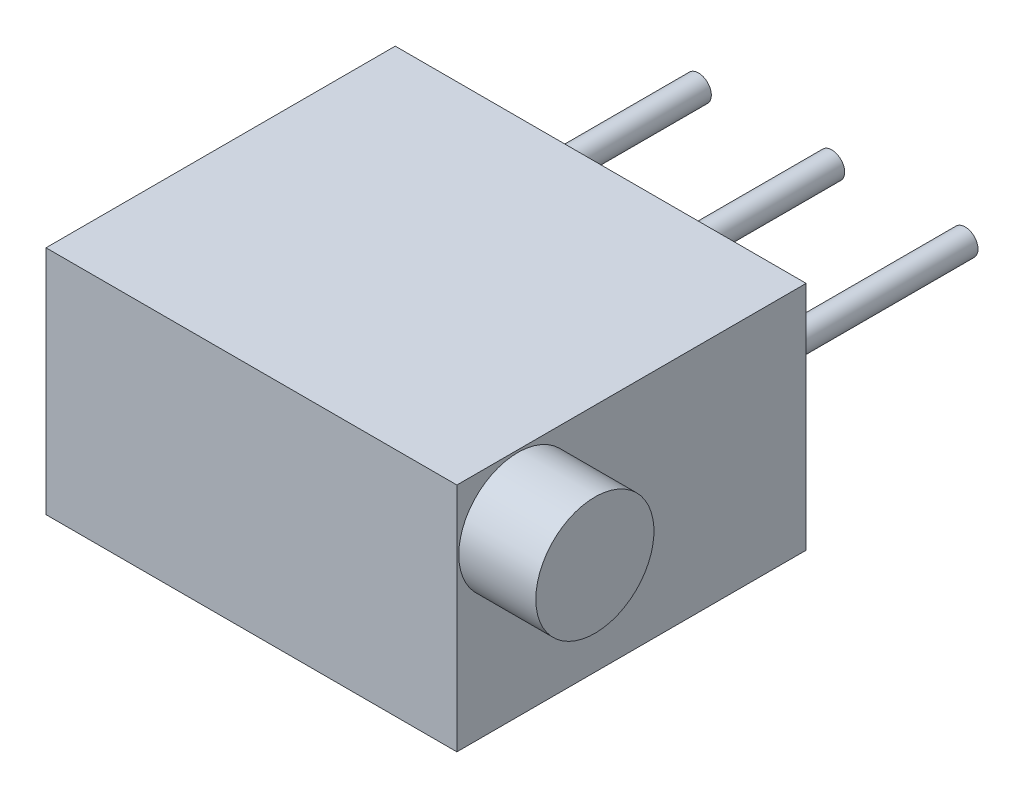
ISO-10303-21;
HEADER;
FILE_DESCRIPTION(('STEP AP214'),'2;1');
FILE_NAME('part.step','',(''),(''),'','','');
FILE_SCHEMA(('AUTOMOTIVE_DESIGN { 1 0 10303 214 1 1 1 1 }'));
ENDSEC;
DATA;
#1=APPLICATION_CONTEXT('core data for automotive mechanical design processes');
#2=APPLICATION_PROTOCOL_DEFINITION('international standard','automotive_design',2000,#1);
#3=PRODUCT_CONTEXT('',#1,'mechanical');
#4=PRODUCT('Part','Part','',(#3));
#5=PRODUCT_RELATED_PRODUCT_CATEGORY('part','',(#4));
#6=PRODUCT_DEFINITION_FORMATION('','',#4);
#7=PRODUCT_DEFINITION_CONTEXT('part definition',#1,'design');
#8=PRODUCT_DEFINITION('design','',#6,#7);
#9=PRODUCT_DEFINITION_SHAPE('','',#8);
#10=(LENGTH_UNIT() NAMED_UNIT(*) SI_UNIT(.MILLI.,.METRE.));
#11=(NAMED_UNIT(*) PLANE_ANGLE_UNIT() SI_UNIT($,.RADIAN.));
#12=(NAMED_UNIT(*) SI_UNIT($,.STERADIAN.) SOLID_ANGLE_UNIT());
#13=UNCERTAINTY_MEASURE_WITH_UNIT(LENGTH_MEASURE(1.E-05),#10,'distance_accuracy_value','');
#14=(GEOMETRIC_REPRESENTATION_CONTEXT(3) GLOBAL_UNCERTAINTY_ASSIGNED_CONTEXT((#13)) GLOBAL_UNIT_ASSIGNED_CONTEXT((#10,
#11,#12)) REPRESENTATION_CONTEXT('',''));
#15=CARTESIAN_POINT('',(0.,0.,0.));
#16=DIRECTION('',(0.,0.,1.));
#17=DIRECTION('',(1.,0.,0.));
#18=AXIS2_PLACEMENT_3D('',#15,#16,#17);
#19=CARTESIAN_POINT('',(-4.,4.5,-3.4));
#20=DIRECTION('',(0.,0.,1.));
#21=DIRECTION('',(1.,0.,0.));
#22=AXIS2_PLACEMENT_3D('',#19,#20,#21);
#23=PLANE('',#22);
#24=CARTESIAN_POINT('',(-2.59597838181529,2.25,-3.40000000000001));
#25=DIRECTION('',(0.,0.,1.));
#26=DIRECTION('',(1.,0.,0.));
#27=AXIS2_PLACEMENT_3D('',#24,#25,#26);
#28=CIRCLE('',#27,0.25);
#29=CARTESIAN_POINT('',(-2.34597838181529,2.25,-3.40000000000001));
#30=VERTEX_POINT('',#29);
#31=EDGE_CURVE('E42',#30,#30,#28,.F.);
#32=ORIENTED_EDGE('',*,*,#31,.F.);
#33=EDGE_LOOP('',(#32));
#34=FACE_BOUND('',#33,.T.);
#35=DIRECTION('',(-1.,0.,0.));
#36=VECTOR('',#35,1.);
#37=CARTESIAN_POINT('',(-4.,0.,-3.4));
#38=LINE('',#37,#36);
#39=CARTESIAN_POINT('',(4.,0.,-3.40000000000001));
#40=VERTEX_POINT('',#39);
#41=CARTESIAN_POINT('',(-4.,0.,-3.4));
#42=VERTEX_POINT('',#41);
#43=EDGE_CURVE('E73',#40,#42,#38,.T.);
#44=ORIENTED_EDGE('',*,*,#43,.T.);
#45=DIRECTION('',(0.,-1.,0.));
#46=VECTOR('',#45,1.);
#47=CARTESIAN_POINT('',(-4.,4.5,-3.4));
#48=LINE('',#47,#46);
#49=CARTESIAN_POINT('',(-4.,4.5,-3.4));
#50=VERTEX_POINT('',#49);
#51=EDGE_CURVE('E97',#50,#42,#48,.T.);
#52=ORIENTED_EDGE('',*,*,#51,.F.);
#53=DIRECTION('',(-1.,0.,0.));
#54=VECTOR('',#53,1.);
#55=CARTESIAN_POINT('',(-4.,4.5,-3.4));
#56=LINE('',#55,#54);
#57=CARTESIAN_POINT('',(4.,4.5,-3.40000000000001));
#58=VERTEX_POINT('',#57);
#59=EDGE_CURVE('E50',#58,#50,#56,.T.);
#60=ORIENTED_EDGE('',*,*,#59,.F.);
#61=DIRECTION('',(0.,-1.,0.));
#62=VECTOR('',#61,1.);
#63=CARTESIAN_POINT('',(4.,4.5,-3.40000000000001));
#64=LINE('',#63,#62);
#65=EDGE_CURVE('E93',#58,#40,#64,.T.);
#66=ORIENTED_EDGE('',*,*,#65,.T.);
#67=EDGE_LOOP('',(#44,#52,#60,#66));
#68=FACE_BOUND('',#67,.T.);
#69=CARTESIAN_POINT('',(0.,2.25,-3.40000000000001));
#70=DIRECTION('',(0.,0.,1.));
#71=DIRECTION('',(1.,0.,0.));
#72=AXIS2_PLACEMENT_3D('',#69,#70,#71);
#73=CIRCLE('',#72,0.25);
#74=CARTESIAN_POINT('',(0.250000000000008,2.25,-3.40000000000001));
#75=VERTEX_POINT('',#74);
#76=EDGE_CURVE('E111',#75,#75,#73,.F.);
#77=ORIENTED_EDGE('',*,*,#76,.F.);
#78=EDGE_LOOP('',(#77));
#79=FACE_BOUND('',#78,.T.);
#80=CARTESIAN_POINT('',(2.5959783818153,2.25,-3.40000000000001));
#81=DIRECTION('',(0.,0.,1.));
#82=DIRECTION('',(1.,0.,0.));
#83=AXIS2_PLACEMENT_3D('',#80,#81,#82);
#84=CIRCLE('',#83,0.25);
#85=CARTESIAN_POINT('',(2.8459783818153,2.25,-3.40000000000001));
#86=VERTEX_POINT('',#85);
#87=EDGE_CURVE('E11',#86,#86,#84,.F.);
#88=ORIENTED_EDGE('',*,*,#87,.F.);
#89=EDGE_LOOP('',(#88));
#90=FACE_BOUND('',#89,.T.);
#91=ADVANCED_FACE('F33',(#34,#68,#79,#90),#23,.F.);
#92=CARTESIAN_POINT('',(-4.,4.5,-3.4));
#93=DIRECTION('',(1.,0.,0.));
#94=DIRECTION('',(0.,0.,-1.));
#95=AXIS2_PLACEMENT_3D('',#92,#93,#94);
#96=PLANE('',#95);
#97=DIRECTION('',(0.,0.,1.));
#98=VECTOR('',#97,1.);
#99=CARTESIAN_POINT('',(-4.,0.,-3.4));
#100=LINE('',#99,#98);
#101=CARTESIAN_POINT('',(-4.,0.,3.39999999999999));
#102=VERTEX_POINT('',#101);
#103=EDGE_CURVE('E101',#42,#102,#100,.T.);
#104=ORIENTED_EDGE('',*,*,#103,.T.);
#105=DIRECTION('',(0.,-1.,0.));
#106=VECTOR('',#105,1.);
#107=CARTESIAN_POINT('',(-4.,4.5,3.39999999999999));
#108=LINE('',#107,#106);
#109=CARTESIAN_POINT('',(-4.,4.5,3.39999999999999));
#110=VERTEX_POINT('',#109);
#111=EDGE_CURVE('E92',#110,#102,#108,.T.);
#112=ORIENTED_EDGE('',*,*,#111,.F.);
#113=DIRECTION('',(0.,0.,1.));
#114=VECTOR('',#113,1.);
#115=CARTESIAN_POINT('',(-4.,4.5,-3.4));
#116=LINE('',#115,#114);
#117=EDGE_CURVE('E86',#50,#110,#116,.T.);
#118=ORIENTED_EDGE('',*,*,#117,.F.);
#119=ORIENTED_EDGE('',*,*,#51,.T.);
#120=EDGE_LOOP('',(#104,#112,#118,#119));
#121=FACE_BOUND('',#120,.T.);
#122=ADVANCED_FACE('F35',(#121),#96,.F.);
#123=CARTESIAN_POINT('',(-4.,4.5,3.39999999999999));
#124=DIRECTION('',(0.,0.,-1.));
#125=DIRECTION('',(-1.,0.,0.));
#126=AXIS2_PLACEMENT_3D('',#123,#124,#125);
#127=PLANE('',#126);
#128=DIRECTION('',(1.,0.,0.));
#129=VECTOR('',#128,1.);
#130=CARTESIAN_POINT('',(-4.,0.,3.39999999999999));
#131=LINE('',#130,#129);
#132=CARTESIAN_POINT('',(4.00000000000002,0.,3.39999999999999));
#133=VERTEX_POINT('',#132);
#134=EDGE_CURVE('E91',#102,#133,#131,.T.);
#135=ORIENTED_EDGE('',*,*,#134,.T.);
#136=DIRECTION('',(0.,-1.,0.));
#137=VECTOR('',#136,1.);
#138=CARTESIAN_POINT('',(4.00000000000002,4.5,3.39999999999999));
#139=LINE('',#138,#137);
#140=CARTESIAN_POINT('',(4.00000000000002,4.5,3.39999999999999));
#141=VERTEX_POINT('',#140);
#142=EDGE_CURVE('E89',#141,#133,#139,.T.);
#143=ORIENTED_EDGE('',*,*,#142,.F.);
#144=DIRECTION('',(1.,0.,0.));
#145=VECTOR('',#144,1.);
#146=CARTESIAN_POINT('',(-4.,4.5,3.39999999999999));
#147=LINE('',#146,#145);
#148=EDGE_CURVE('E81',#110,#141,#147,.T.);
#149=ORIENTED_EDGE('',*,*,#148,.F.);
#150=ORIENTED_EDGE('',*,*,#111,.T.);
#151=EDGE_LOOP('',(#135,#143,#149,#150));
#152=FACE_BOUND('',#151,.T.);
#153=ADVANCED_FACE('F90',(#152),#127,.F.);
#154=CARTESIAN_POINT('',(4.,4.5,-3.40000000000001));
#155=DIRECTION('',(-1.,0.,0.));
#156=DIRECTION('',(0.,0.,1.));
#157=AXIS2_PLACEMENT_3D('',#154,#155,#156);
#158=PLANE('',#157);
#159=CARTESIAN_POINT('',(4.00000000000001,3.3048451929394,2.21305906698641));
#160=DIRECTION('',(-1.,0.,0.));
#161=DIRECTION('',(0.,0.,1.));
#162=AXIS2_PLACEMENT_3D('',#159,#160,#161);
#163=CIRCLE('',#162,1.15);
#164=CARTESIAN_POINT('',(4.00000000000002,3.3048451929394,3.36305906698641));
#165=VERTEX_POINT('',#164);
#166=EDGE_CURVE('E180',#165,#165,#163,.T.);
#167=ORIENTED_EDGE('',*,*,#166,.T.);
#168=EDGE_LOOP('',(#167));
#169=FACE_BOUND('',#168,.T.);
#170=DIRECTION('',(0.,0.,-1.));
#171=VECTOR('',#170,1.);
#172=CARTESIAN_POINT('',(4.,0.,-3.40000000000001));
#173=LINE('',#172,#171);
#174=EDGE_CURVE('E67',#133,#40,#173,.T.);
#175=ORIENTED_EDGE('',*,*,#174,.T.);
#176=ORIENTED_EDGE('',*,*,#65,.F.);
#177=DIRECTION('',(0.,0.,-1.));
#178=VECTOR('',#177,1.);
#179=CARTESIAN_POINT('',(4.,4.5,-3.40000000000001));
#180=LINE('',#179,#178);
#181=EDGE_CURVE('E84',#141,#58,#180,.T.);
#182=ORIENTED_EDGE('',*,*,#181,.F.);
#183=ORIENTED_EDGE('',*,*,#142,.T.);
#184=EDGE_LOOP('',(#175,#176,#182,#183));
#185=FACE_BOUND('',#184,.T.);
#186=ADVANCED_FACE('F95',(#169,#185),#158,.F.);
#187=CARTESIAN_POINT('',(-4.,4.5,3.39999999999999));
#188=DIRECTION('',(0.,1.,0.));
#189=DIRECTION('',(0.,0.,1.));
#190=AXIS2_PLACEMENT_3D('',#187,#188,#189);
#191=PLANE('',#190);
#192=ORIENTED_EDGE('',*,*,#117,.T.);
#193=ORIENTED_EDGE('',*,*,#148,.T.);
#194=ORIENTED_EDGE('',*,*,#181,.T.);
#195=ORIENTED_EDGE('',*,*,#59,.T.);
#196=EDGE_LOOP('',(#192,#193,#194,#195));
#197=FACE_BOUND('',#196,.T.);
#198=ADVANCED_FACE('F82',(#197),#191,.T.);
#199=CARTESIAN_POINT('',(-4.,0.,3.39999999999999));
#200=DIRECTION('',(0.,1.,0.));
#201=DIRECTION('',(0.,0.,1.));
#202=AXIS2_PLACEMENT_3D('',#199,#200,#201);
#203=PLANE('',#202);
#204=ORIENTED_EDGE('',*,*,#103,.F.);
#205=ORIENTED_EDGE('',*,*,#43,.F.);
#206=ORIENTED_EDGE('',*,*,#174,.F.);
#207=ORIENTED_EDGE('',*,*,#134,.F.);
#208=EDGE_LOOP('',(#204,#205,#206,#207));
#209=FACE_BOUND('',#208,.T.);
#210=ADVANCED_FACE('F153',(#209),#203,.F.);
#211=CARTESIAN_POINT('',(0.,2.25,-7.9));
#212=DIRECTION('',(0.,0.,1.));
#213=DIRECTION('',(1.,0.,0.));
#214=AXIS2_PLACEMENT_3D('',#211,#212,#213);
#215=CYLINDRICAL_SURFACE('',#214,0.25);
#216=CARTESIAN_POINT('',(0.,2.25,-7.9));
#217=DIRECTION('',(0.,0.,-1.));
#218=DIRECTION('',(-1.,0.,0.));
#219=AXIS2_PLACEMENT_3D('',#216,#217,#218);
#220=CIRCLE('',#219,0.25);
#221=CARTESIAN_POINT('',(-0.249999999999992,2.25,-7.9));
#222=VERTEX_POINT('',#221);
#223=EDGE_CURVE('E104',#222,#222,#220,.T.);
#224=ORIENTED_EDGE('',*,*,#223,.F.);
#225=EDGE_LOOP('',(#224));
#226=FACE_BOUND('',#225,.T.);
#227=ORIENTED_EDGE('',*,*,#76,.T.);
#228=EDGE_LOOP('',(#227));
#229=FACE_BOUND('',#228,.T.);
#230=ADVANCED_FACE('F149',(#226,#229),#215,.T.);
#231=CARTESIAN_POINT('',(0.,2.25,-7.9));
#232=DIRECTION('',(0.,0.,-1.));
#233=DIRECTION('',(-1.,0.,0.));
#234=AXIS2_PLACEMENT_3D('',#231,#232,#233);
#235=PLANE('',#234);
#236=ORIENTED_EDGE('',*,*,#223,.T.);
#237=EDGE_LOOP('',(#236));
#238=FACE_BOUND('',#237,.T.);
#239=ADVANCED_FACE('F145',(#238),#235,.T.);
#240=CARTESIAN_POINT('',(-2.59597838181529,2.25,-7.9));
#241=DIRECTION('',(0.,0.,1.));
#242=DIRECTION('',(1.,0.,0.));
#243=AXIS2_PLACEMENT_3D('',#240,#241,#242);
#244=CYLINDRICAL_SURFACE('',#243,0.25);
#245=CARTESIAN_POINT('',(-2.59597838181529,2.25,-7.9));
#246=DIRECTION('',(0.,0.,-1.));
#247=DIRECTION('',(-1.,0.,0.));
#248=AXIS2_PLACEMENT_3D('',#245,#246,#247);
#249=CIRCLE('',#248,0.25);
#250=CARTESIAN_POINT('',(-2.84597838181529,2.25,-7.9));
#251=VERTEX_POINT('',#250);
#252=EDGE_CURVE('E173',#251,#251,#249,.T.);
#253=ORIENTED_EDGE('',*,*,#252,.F.);
#254=EDGE_LOOP('',(#253));
#255=FACE_BOUND('',#254,.T.);
#256=ORIENTED_EDGE('',*,*,#31,.T.);
#257=EDGE_LOOP('',(#256));
#258=FACE_BOUND('',#257,.T.);
#259=ADVANCED_FACE('F116',(#255,#258),#244,.T.);
#260=CARTESIAN_POINT('',(-2.59597838181529,2.25,-7.9));
#261=DIRECTION('',(0.,0.,-1.));
#262=DIRECTION('',(-1.,0.,0.));
#263=AXIS2_PLACEMENT_3D('',#260,#261,#262);
#264=PLANE('',#263);
#265=ORIENTED_EDGE('',*,*,#252,.T.);
#266=EDGE_LOOP('',(#265));
#267=FACE_BOUND('',#266,.T.);
#268=ADVANCED_FACE('F128',(#267),#264,.T.);
#269=CARTESIAN_POINT('',(2.5959783818153,2.25,-7.9));
#270=DIRECTION('',(0.,0.,1.));
#271=DIRECTION('',(1.,0.,0.));
#272=AXIS2_PLACEMENT_3D('',#269,#270,#271);
#273=CYLINDRICAL_SURFACE('',#272,0.25);
#274=CARTESIAN_POINT('',(2.5959783818153,2.25,-7.9));
#275=DIRECTION('',(0.,0.,-1.));
#276=DIRECTION('',(1.,0.,0.));
#277=AXIS2_PLACEMENT_3D('',#274,#275,#276);
#278=CIRCLE('',#277,0.25);
#279=CARTESIAN_POINT('',(2.8459783818153,2.25,-7.9));
#280=VERTEX_POINT('',#279);
#281=EDGE_CURVE('E176',#280,#280,#278,.T.);
#282=ORIENTED_EDGE('',*,*,#281,.F.);
#283=EDGE_LOOP('',(#282));
#284=FACE_BOUND('',#283,.T.);
#285=ORIENTED_EDGE('',*,*,#87,.T.);
#286=EDGE_LOOP('',(#285));
#287=FACE_BOUND('',#286,.T.);
#288=ADVANCED_FACE('F125',(#284,#287),#273,.T.);
#289=CARTESIAN_POINT('',(2.5959783818153,2.25,-7.9));
#290=DIRECTION('',(0.,0.,1.));
#291=DIRECTION('',(1.,0.,0.));
#292=AXIS2_PLACEMENT_3D('',#289,#290,#291);
#293=PLANE('',#292);
#294=ORIENTED_EDGE('',*,*,#281,.T.);
#295=EDGE_LOOP('',(#294));
#296=FACE_BOUND('',#295,.T.);
#297=ADVANCED_FACE('F127',(#296),#293,.F.);
#298=CARTESIAN_POINT('',(5.50000000000001,3.3048451929394,2.2130590669864));
#299=DIRECTION('',(-1.,0.,0.));
#300=DIRECTION('',(0.,0.,1.));
#301=AXIS2_PLACEMENT_3D('',#298,#299,#300);
#302=CYLINDRICAL_SURFACE('',#301,1.15);
#303=CARTESIAN_POINT('',(5.50000000000001,3.3048451929394,2.2130590669864));
#304=DIRECTION('',(-1.,0.,0.));
#305=DIRECTION('',(0.,0.,1.));
#306=AXIS2_PLACEMENT_3D('',#303,#304,#305);
#307=CIRCLE('',#306,1.15);
#308=CARTESIAN_POINT('',(5.50000000000002,3.3048451929394,3.3630590669864));
#309=VERTEX_POINT('',#308);
#310=EDGE_CURVE('E179',#309,#309,#307,.T.);
#311=ORIENTED_EDGE('',*,*,#310,.T.);
#312=EDGE_LOOP('',(#311));
#313=FACE_BOUND('',#312,.T.);
#314=ORIENTED_EDGE('',*,*,#166,.F.);
#315=EDGE_LOOP('',(#314));
#316=FACE_BOUND('',#315,.T.);
#317=ADVANCED_FACE('F135',(#313,#316),#302,.T.);
#318=CARTESIAN_POINT('',(5.50000000000001,3.3048451929394,2.2130590669864));
#319=DIRECTION('',(-1.,0.,0.));
#320=DIRECTION('',(0.,0.,1.));
#321=AXIS2_PLACEMENT_3D('',#318,#319,#320);
#322=PLANE('',#321);
#323=ORIENTED_EDGE('',*,*,#310,.F.);
#324=EDGE_LOOP('',(#323));
#325=FACE_BOUND('',#324,.T.);
#326=ADVANCED_FACE('F188',(#325),#322,.F.);
#327=CLOSED_SHELL('',(#91,#122,#153,#186,#198,#210,#230,#239,#259,#268,#288,#297,#317,#326));
#328=MANIFOLD_SOLID_BREP('B2',#327);
#329=ADVANCED_BREP_SHAPE_REPRESENTATION('',(#18,#328),#14);
#330=SHAPE_DEFINITION_REPRESENTATION(#9,#329);
ENDSEC;
END-ISO-10303-21;
